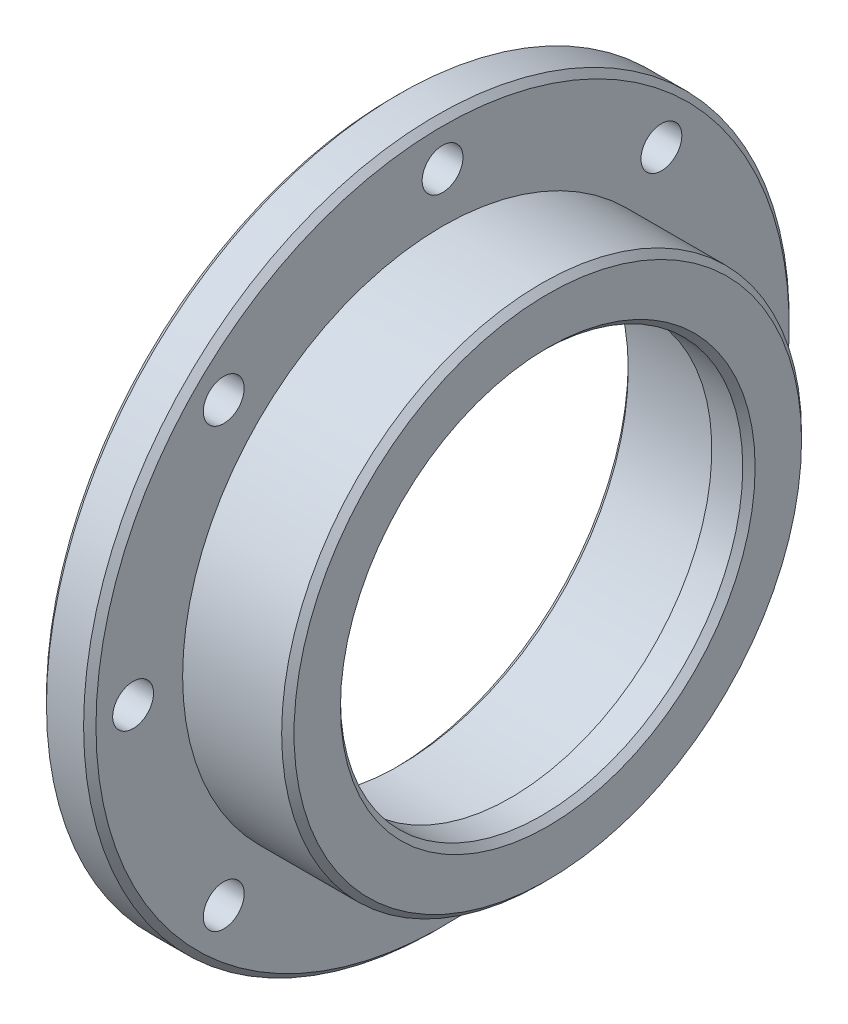
ISO-10303-21;
HEADER;
FILE_DESCRIPTION(('STEP AP214'),'2;1');
FILE_NAME('part.step','',(''),(''),'','','');
FILE_SCHEMA(('AUTOMOTIVE_DESIGN { 1 0 10303 214 1 1 1 1 }'));
ENDSEC;
DATA;
#1=APPLICATION_CONTEXT('core data for automotive mechanical design processes');
#2=APPLICATION_PROTOCOL_DEFINITION('international standard','automotive_design',2000,#1);
#3=PRODUCT_CONTEXT('',#1,'mechanical');
#4=PRODUCT('Part','Part','',(#3));
#5=PRODUCT_RELATED_PRODUCT_CATEGORY('part','',(#4));
#6=PRODUCT_DEFINITION_FORMATION('','',#4);
#7=PRODUCT_DEFINITION_CONTEXT('part definition',#1,'design');
#8=PRODUCT_DEFINITION('design','',#6,#7);
#9=PRODUCT_DEFINITION_SHAPE('','',#8);
#10=(LENGTH_UNIT() NAMED_UNIT(*) SI_UNIT(.MILLI.,.METRE.));
#11=(NAMED_UNIT(*) PLANE_ANGLE_UNIT() SI_UNIT($,.RADIAN.));
#12=(NAMED_UNIT(*) SI_UNIT($,.STERADIAN.) SOLID_ANGLE_UNIT());
#13=UNCERTAINTY_MEASURE_WITH_UNIT(LENGTH_MEASURE(1.E-05),#10,'distance_accuracy_value','');
#14=(GEOMETRIC_REPRESENTATION_CONTEXT(3) GLOBAL_UNCERTAINTY_ASSIGNED_CONTEXT((#13)) GLOBAL_UNIT_ASSIGNED_CONTEXT((#10,
#11,#12)) REPRESENTATION_CONTEXT('',''));
#15=CARTESIAN_POINT('',(0.,0.,0.));
#16=DIRECTION('',(0.,0.,1.));
#17=DIRECTION('',(1.,0.,0.));
#18=AXIS2_PLACEMENT_3D('',#15,#16,#17);
#19=CARTESIAN_POINT('',(4.,21.,0.));
#20=DIRECTION('',(-1.,0.,0.));
#21=DIRECTION('',(0.,0.,1.));
#22=AXIS2_PLACEMENT_3D('',#19,#20,#21);
#23=PLANE('',#22);
#24=CARTESIAN_POINT('',(4.,17.6776695296639,17.6776695296635));
#25=DIRECTION('',(1.,0.,0.));
#26=DIRECTION('',(0.,0.,-1.));
#27=AXIS2_PLACEMENT_3D('',#24,#25,#26);
#28=CIRCLE('',#27,1.64999999999999);
#29=CARTESIAN_POINT('',(4.,17.6776695296639,16.0276695296635));
#30=VERTEX_POINT('',#29);
#31=EDGE_CURVE('E172',#30,#30,#28,.T.);
#32=ORIENTED_EDGE('',*,*,#31,.F.);
#33=EDGE_LOOP('',(#32));
#34=FACE_BOUND('',#33,.T.);
#35=CARTESIAN_POINT('',(4.,-17.6776695296635,17.6776695296638));
#36=DIRECTION('',(1.,0.,0.));
#37=DIRECTION('',(0.,0.,-1.));
#38=AXIS2_PLACEMENT_3D('',#35,#36,#37);
#39=CIRCLE('',#38,1.64999999999999);
#40=CARTESIAN_POINT('',(4.,-17.6776695296635,16.0276695296639));
#41=VERTEX_POINT('',#40);
#42=EDGE_CURVE('E156',#41,#41,#39,.T.);
#43=ORIENTED_EDGE('',*,*,#42,.F.);
#44=EDGE_LOOP('',(#43));
#45=FACE_BOUND('',#44,.T.);
#46=CARTESIAN_POINT('',(4.,-25.,0.));
#47=DIRECTION('',(1.,0.,0.));
#48=DIRECTION('',(0.,0.,-1.));
#49=AXIS2_PLACEMENT_3D('',#46,#47,#48);
#50=CIRCLE('',#49,1.64999999999999);
#51=CARTESIAN_POINT('',(4.,-25.,-1.64999999999999));
#52=VERTEX_POINT('',#51);
#53=EDGE_CURVE('E148',#52,#52,#50,.T.);
#54=ORIENTED_EDGE('',*,*,#53,.F.);
#55=EDGE_LOOP('',(#54));
#56=FACE_BOUND('',#55,.T.);
#57=CARTESIAN_POINT('',(4.,-17.6776695296638,-17.6776695296636));
#58=DIRECTION('',(1.,0.,0.));
#59=DIRECTION('',(0.,0.,-1.));
#60=AXIS2_PLACEMENT_3D('',#57,#58,#59);
#61=CIRCLE('',#60,1.64999999999999);
#62=CARTESIAN_POINT('',(4.,-17.6776695296638,-19.3276695296636));
#63=VERTEX_POINT('',#62);
#64=EDGE_CURVE('E140',#63,#63,#61,.T.);
#65=ORIENTED_EDGE('',*,*,#64,.F.);
#66=EDGE_LOOP('',(#65));
#67=FACE_BOUND('',#66,.T.);
#68=CARTESIAN_POINT('',(4.,0.,-25.));
#69=DIRECTION('',(1.,0.,0.));
#70=DIRECTION('',(0.,0.,-1.));
#71=AXIS2_PLACEMENT_3D('',#68,#69,#70);
#72=CIRCLE('',#71,1.64999999999999);
#73=CARTESIAN_POINT('',(4.,0.,-26.65));
#74=VERTEX_POINT('',#73);
#75=EDGE_CURVE('E132',#74,#74,#72,.T.);
#76=ORIENTED_EDGE('',*,*,#75,.F.);
#77=EDGE_LOOP('',(#76));
#78=FACE_BOUND('',#77,.T.);
#79=CARTESIAN_POINT('',(4.,17.6776695296637,-17.6776695296637));
#80=DIRECTION('',(1.,0.,0.));
#81=DIRECTION('',(0.,0.,-1.));
#82=AXIS2_PLACEMENT_3D('',#79,#80,#81);
#83=CIRCLE('',#82,1.64999999999999);
#84=CARTESIAN_POINT('',(4.,17.6776695296637,-19.3276695296637));
#85=VERTEX_POINT('',#84);
#86=EDGE_CURVE('E124',#85,#85,#83,.T.);
#87=ORIENTED_EDGE('',*,*,#86,.F.);
#88=EDGE_LOOP('',(#87));
#89=FACE_BOUND('',#88,.T.);
#90=CARTESIAN_POINT('',(4.,25.,0.));
#91=DIRECTION('',(1.,0.,0.));
#92=DIRECTION('',(0.,0.,-1.));
#93=AXIS2_PLACEMENT_3D('',#90,#91,#92);
#94=CIRCLE('',#93,1.64999999999999);
#95=CARTESIAN_POINT('',(4.,25.,-1.64999999999999));
#96=VERTEX_POINT('',#95);
#97=EDGE_CURVE('E116',#96,#96,#94,.T.);
#98=ORIENTED_EDGE('',*,*,#97,.F.);
#99=EDGE_LOOP('',(#98));
#100=FACE_BOUND('',#99,.T.);
#101=CARTESIAN_POINT('',(4.,0.,0.));
#102=DIRECTION('',(-1.,0.,0.));
#103=DIRECTION('',(0.,0.,1.));
#104=AXIS2_PLACEMENT_3D('',#101,#102,#103);
#105=CIRCLE('',#104,28.);
#106=CARTESIAN_POINT('',(4.,0.,28.));
#107=VERTEX_POINT('',#106);
#108=EDGE_CURVE('E58',#107,#107,#105,.F.);
#109=ORIENTED_EDGE('',*,*,#108,.T.);
#110=EDGE_LOOP('',(#109));
#111=FACE_BOUND('',#110,.T.);
#112=CARTESIAN_POINT('',(4.,0.,0.));
#113=DIRECTION('',(-1.,0.,0.));
#114=DIRECTION('',(0.,0.,1.));
#115=AXIS2_PLACEMENT_3D('',#112,#113,#114);
#116=CIRCLE('',#115,21.);
#117=CARTESIAN_POINT('',(4.,0.,21.));
#118=VERTEX_POINT('',#117);
#119=EDGE_CURVE('E102',#118,#118,#116,.F.);
#120=ORIENTED_EDGE('',*,*,#119,.F.);
#121=EDGE_LOOP('',(#120));
#122=FACE_BOUND('',#121,.T.);
#123=CARTESIAN_POINT('',(4.,2.61861100413235E-13,25.));
#124=DIRECTION('',(1.,0.,0.));
#125=DIRECTION('',(0.,0.,-1.));
#126=AXIS2_PLACEMENT_3D('',#123,#124,#125);
#127=CIRCLE('',#126,1.64999999999999);
#128=CARTESIAN_POINT('',(4.,2.61861100413235E-13,23.35));
#129=VERTEX_POINT('',#128);
#130=EDGE_CURVE('E164',#129,#129,#127,.T.);
#131=ORIENTED_EDGE('',*,*,#130,.F.);
#132=EDGE_LOOP('',(#131));
#133=FACE_BOUND('',#132,.T.);
#134=ADVANCED_FACE('F49',(#34,#45,#56,#67,#78,#89,#100,#111,#122,#133),#23,.F.);
#135=CARTESIAN_POINT('',(9.5,21.,0.));
#136=DIRECTION('',(1.,0.,0.));
#137=DIRECTION('',(0.,0.,-1.));
#138=AXIS2_PLACEMENT_3D('',#135,#136,#137);
#139=PLANE('',#138);
#140=CARTESIAN_POINT('',(9.5,0.,0.));
#141=DIRECTION('',(-1.,0.,0.));
#142=DIRECTION('',(0.,0.,1.));
#143=AXIS2_PLACEMENT_3D('',#140,#141,#142);
#144=CIRCLE('',#143,16.25);
#145=CARTESIAN_POINT('',(9.5,0.,16.25));
#146=VERTEX_POINT('',#145);
#147=EDGE_CURVE('E106',#146,#146,#144,.T.);
#148=ORIENTED_EDGE('',*,*,#147,.F.);
#149=EDGE_LOOP('',(#148));
#150=FACE_BOUND('',#149,.T.);
#151=CARTESIAN_POINT('',(9.5,0.,0.));
#152=DIRECTION('',(1.,0.,0.));
#153=DIRECTION('',(0.,0.,-1.));
#154=AXIS2_PLACEMENT_3D('',#151,#152,#153);
#155=CIRCLE('',#154,18.5);
#156=CARTESIAN_POINT('',(9.5,0.,-18.5));
#157=VERTEX_POINT('',#156);
#158=EDGE_CURVE('E101',#157,#157,#155,.T.);
#159=ORIENTED_EDGE('',*,*,#158,.F.);
#160=EDGE_LOOP('',(#159));
#161=FACE_BOUND('',#160,.T.);
#162=ADVANCED_FACE('F182',(#150,#161),#139,.F.);
#163=CARTESIAN_POINT('',(12.5,21.,0.));
#164=DIRECTION('',(1.,0.,0.));
#165=DIRECTION('',(0.,0.,-1.));
#166=AXIS2_PLACEMENT_3D('',#163,#164,#165);
#167=PLANE('',#166);
#168=CARTESIAN_POINT('',(12.5,0.,0.));
#169=DIRECTION('',(1.,0.,0.));
#170=DIRECTION('',(0.,0.,-1.));
#171=AXIS2_PLACEMENT_3D('',#168,#169,#170);
#172=CIRCLE('',#171,20.5);
#173=CARTESIAN_POINT('',(12.5,0.,-20.5));
#174=VERTEX_POINT('',#173);
#175=EDGE_CURVE('E89',#174,#174,#172,.T.);
#176=ORIENTED_EDGE('',*,*,#175,.T.);
#177=EDGE_LOOP('',(#176));
#178=FACE_BOUND('',#177,.T.);
#179=CARTESIAN_POINT('',(12.5,0.,0.));
#180=DIRECTION('',(1.,0.,0.));
#181=DIRECTION('',(0.,0.,-1.));
#182=AXIS2_PLACEMENT_3D('',#179,#180,#181);
#183=CIRCLE('',#182,16.75);
#184=CARTESIAN_POINT('',(12.5,0.,-16.75));
#185=VERTEX_POINT('',#184);
#186=EDGE_CURVE('E93',#185,#185,#183,.F.);
#187=ORIENTED_EDGE('',*,*,#186,.T.);
#188=EDGE_LOOP('',(#187));
#189=FACE_BOUND('',#188,.T.);
#190=ADVANCED_FACE('F245',(#178,#189),#167,.T.);
#191=CARTESIAN_POINT('',(0.,0.,0.));
#192=DIRECTION('',(-1.,0.,0.));
#193=DIRECTION('',(0.,0.,1.));
#194=AXIS2_PLACEMENT_3D('',#191,#192,#193);
#195=CYLINDRICAL_SURFACE('',#194,21.);
#196=CARTESIAN_POINT('',(12.,0.,0.));
#197=DIRECTION('',(1.,0.,0.));
#198=DIRECTION('',(0.,0.,-1.));
#199=AXIS2_PLACEMENT_3D('',#196,#197,#198);
#200=CIRCLE('',#199,21.);
#201=CARTESIAN_POINT('',(12.,0.,-21.));
#202=VERTEX_POINT('',#201);
#203=EDGE_CURVE('E97',#202,#202,#200,.F.);
#204=ORIENTED_EDGE('',*,*,#203,.T.);
#205=EDGE_LOOP('',(#204));
#206=FACE_BOUND('',#205,.T.);
#207=ORIENTED_EDGE('',*,*,#119,.T.);
#208=EDGE_LOOP('',(#207));
#209=FACE_BOUND('',#208,.T.);
#210=ADVANCED_FACE('F240',(#206,#209),#195,.T.);
#211=CARTESIAN_POINT('',(0.,0.,0.));
#212=DIRECTION('',(-1.,0.,0.));
#213=DIRECTION('',(0.,0.,1.));
#214=AXIS2_PLACEMENT_3D('',#211,#212,#213);
#215=CYLINDRICAL_SURFACE('',#214,16.25);
#216=CARTESIAN_POINT('',(12.,0.,0.));
#217=DIRECTION('',(1.,0.,0.));
#218=DIRECTION('',(0.,0.,-1.));
#219=AXIS2_PLACEMENT_3D('',#216,#217,#218);
#220=CIRCLE('',#219,16.25);
#221=CARTESIAN_POINT('',(12.,0.,-16.25));
#222=VERTEX_POINT('',#221);
#223=EDGE_CURVE('E85',#222,#222,#220,.T.);
#224=ORIENTED_EDGE('',*,*,#223,.T.);
#225=EDGE_LOOP('',(#224));
#226=FACE_BOUND('',#225,.T.);
#227=ORIENTED_EDGE('',*,*,#147,.T.);
#228=EDGE_LOOP('',(#227));
#229=FACE_BOUND('',#228,.T.);
#230=ADVANCED_FACE('F236',(#226,#229),#215,.F.);
#231=CARTESIAN_POINT('',(0.,0.,0.));
#232=DIRECTION('',(-1.,0.,0.));
#233=DIRECTION('',(0.,0.,1.));
#234=AXIS2_PLACEMENT_3D('',#231,#232,#233);
#235=CYLINDRICAL_SURFACE('',#234,28.5);
#236=CARTESIAN_POINT('',(0.500000000000004,0.,0.));
#237=DIRECTION('',(1.,0.,0.));
#238=DIRECTION('',(0.,0.,-1.));
#239=AXIS2_PLACEMENT_3D('',#236,#237,#238);
#240=CIRCLE('',#239,28.5);
#241=CARTESIAN_POINT('',(0.500000000000004,0.,-28.5));
#242=VERTEX_POINT('',#241);
#243=EDGE_CURVE('E66',#242,#242,#240,.T.);
#244=ORIENTED_EDGE('',*,*,#243,.T.);
#245=EDGE_LOOP('',(#244));
#246=FACE_BOUND('',#245,.T.);
#247=CARTESIAN_POINT('',(3.49999999999999,0.,0.));
#248=DIRECTION('',(-1.,0.,0.));
#249=DIRECTION('',(0.,0.,1.));
#250=AXIS2_PLACEMENT_3D('',#247,#248,#249);
#251=CIRCLE('',#250,28.5);
#252=CARTESIAN_POINT('',(3.49999999999999,0.,28.5));
#253=VERTEX_POINT('',#252);
#254=EDGE_CURVE('E74',#253,#253,#251,.T.);
#255=ORIENTED_EDGE('',*,*,#254,.T.);
#256=EDGE_LOOP('',(#255));
#257=FACE_BOUND('',#256,.T.);
#258=ADVANCED_FACE('F239',(#246,#257),#235,.T.);
#259=CARTESIAN_POINT('',(0.,21.,0.));
#260=DIRECTION('',(1.,0.,0.));
#261=DIRECTION('',(0.,0.,-1.));
#262=AXIS2_PLACEMENT_3D('',#259,#260,#261);
#263=PLANE('',#262);
#264=CARTESIAN_POINT('',(0.,17.6776695296639,17.6776695296635));
#265=DIRECTION('',(1.,0.,0.));
#266=DIRECTION('',(0.,0.,-1.));
#267=AXIS2_PLACEMENT_3D('',#264,#265,#266);
#268=CIRCLE('',#267,1.65);
#269=CARTESIAN_POINT('',(0.,17.6776695296639,16.0276695296635));
#270=VERTEX_POINT('',#269);
#271=EDGE_CURVE('E168',#270,#270,#268,.T.);
#272=ORIENTED_EDGE('',*,*,#271,.T.);
#273=EDGE_LOOP('',(#272));
#274=FACE_BOUND('',#273,.T.);
#275=CARTESIAN_POINT('',(0.,2.61861100413235E-13,25.));
#276=DIRECTION('',(1.,0.,0.));
#277=DIRECTION('',(0.,0.,-1.));
#278=AXIS2_PLACEMENT_3D('',#275,#276,#277);
#279=CIRCLE('',#278,1.65);
#280=CARTESIAN_POINT('',(0.,2.61861100413235E-13,23.35));
#281=VERTEX_POINT('',#280);
#282=EDGE_CURVE('E160',#281,#281,#279,.T.);
#283=ORIENTED_EDGE('',*,*,#282,.T.);
#284=EDGE_LOOP('',(#283));
#285=FACE_BOUND('',#284,.T.);
#286=CARTESIAN_POINT('',(0.,-17.6776695296635,17.6776695296638));
#287=DIRECTION('',(1.,0.,0.));
#288=DIRECTION('',(0.,0.,-1.));
#289=AXIS2_PLACEMENT_3D('',#286,#287,#288);
#290=CIRCLE('',#289,1.65);
#291=CARTESIAN_POINT('',(0.,-17.6776695296635,16.0276695296638));
#292=VERTEX_POINT('',#291);
#293=EDGE_CURVE('E152',#292,#292,#290,.T.);
#294=ORIENTED_EDGE('',*,*,#293,.T.);
#295=EDGE_LOOP('',(#294));
#296=FACE_BOUND('',#295,.T.);
#297=CARTESIAN_POINT('',(0.,-25.,0.));
#298=DIRECTION('',(1.,0.,0.));
#299=DIRECTION('',(0.,0.,-1.));
#300=AXIS2_PLACEMENT_3D('',#297,#298,#299);
#301=CIRCLE('',#300,1.65);
#302=CARTESIAN_POINT('',(0.,-25.,-1.65));
#303=VERTEX_POINT('',#302);
#304=EDGE_CURVE('E144',#303,#303,#301,.T.);
#305=ORIENTED_EDGE('',*,*,#304,.T.);
#306=EDGE_LOOP('',(#305));
#307=FACE_BOUND('',#306,.T.);
#308=CARTESIAN_POINT('',(0.,-17.6776695296638,-17.6776695296636));
#309=DIRECTION('',(1.,0.,0.));
#310=DIRECTION('',(0.,0.,-1.));
#311=AXIS2_PLACEMENT_3D('',#308,#309,#310);
#312=CIRCLE('',#311,1.65);
#313=CARTESIAN_POINT('',(0.,-17.6776695296638,-19.3276695296636));
#314=VERTEX_POINT('',#313);
#315=EDGE_CURVE('E136',#314,#314,#312,.T.);
#316=ORIENTED_EDGE('',*,*,#315,.T.);
#317=EDGE_LOOP('',(#316));
#318=FACE_BOUND('',#317,.T.);
#319=CARTESIAN_POINT('',(0.,0.,-25.));
#320=DIRECTION('',(1.,0.,0.));
#321=DIRECTION('',(0.,0.,-1.));
#322=AXIS2_PLACEMENT_3D('',#319,#320,#321);
#323=CIRCLE('',#322,1.65);
#324=CARTESIAN_POINT('',(0.,0.,-26.65));
#325=VERTEX_POINT('',#324);
#326=EDGE_CURVE('E128',#325,#325,#323,.T.);
#327=ORIENTED_EDGE('',*,*,#326,.T.);
#328=EDGE_LOOP('',(#327));
#329=FACE_BOUND('',#328,.T.);
#330=CARTESIAN_POINT('',(0.,17.6776695296637,-17.6776695296637));
#331=DIRECTION('',(1.,0.,0.));
#332=DIRECTION('',(0.,0.,-1.));
#333=AXIS2_PLACEMENT_3D('',#330,#331,#332);
#334=CIRCLE('',#333,1.65);
#335=CARTESIAN_POINT('',(0.,17.6776695296637,-19.3276695296637));
#336=VERTEX_POINT('',#335);
#337=EDGE_CURVE('E120',#336,#336,#334,.T.);
#338=ORIENTED_EDGE('',*,*,#337,.T.);
#339=EDGE_LOOP('',(#338));
#340=FACE_BOUND('',#339,.T.);
#341=CARTESIAN_POINT('',(0.,25.,0.));
#342=DIRECTION('',(1.,0.,0.));
#343=DIRECTION('',(0.,0.,-1.));
#344=AXIS2_PLACEMENT_3D('',#341,#342,#343);
#345=CIRCLE('',#344,1.65);
#346=CARTESIAN_POINT('',(0.,25.,-1.65));
#347=VERTEX_POINT('',#346);
#348=EDGE_CURVE('E107',#347,#347,#345,.T.);
#349=ORIENTED_EDGE('',*,*,#348,.T.);
#350=EDGE_LOOP('',(#349));
#351=FACE_BOUND('',#350,.T.);
#352=CARTESIAN_POINT('',(0.,0.,0.));
#353=DIRECTION('',(1.,0.,0.));
#354=DIRECTION('',(0.,0.,-1.));
#355=AXIS2_PLACEMENT_3D('',#352,#353,#354);
#356=CIRCLE('',#355,28.);
#357=CARTESIAN_POINT('',(0.,0.,-28.));
#358=VERTEX_POINT('',#357);
#359=EDGE_CURVE('E79',#358,#358,#356,.F.);
#360=ORIENTED_EDGE('',*,*,#359,.T.);
#361=EDGE_LOOP('',(#360));
#362=FACE_BOUND('',#361,.T.);
#363=CARTESIAN_POINT('',(0.,0.,0.));
#364=DIRECTION('',(1.,0.,0.));
#365=DIRECTION('',(0.,0.,-1.));
#366=AXIS2_PLACEMENT_3D('',#363,#364,#365);
#367=CIRCLE('',#366,19.);
#368=CARTESIAN_POINT('',(0.,0.,-19.));
#369=VERTEX_POINT('',#368);
#370=EDGE_CURVE('E82',#369,#369,#367,.T.);
#371=ORIENTED_EDGE('',*,*,#370,.T.);
#372=EDGE_LOOP('',(#371));
#373=FACE_BOUND('',#372,.T.);
#374=ADVANCED_FACE('F255',(#274,#285,#296,#307,#318,#329,#340,#351,#362,#373),#263,.F.);
#375=CARTESIAN_POINT('',(0.,0.,0.));
#376=DIRECTION('',(-1.,0.,0.));
#377=DIRECTION('',(0.,0.,1.));
#378=AXIS2_PLACEMENT_3D('',#375,#376,#377);
#379=CYLINDRICAL_SURFACE('',#378,18.5);
#380=CARTESIAN_POINT('',(0.500000000000004,0.,0.));
#381=DIRECTION('',(1.,0.,0.));
#382=DIRECTION('',(0.,0.,-1.));
#383=AXIS2_PLACEMENT_3D('',#380,#381,#382);
#384=CIRCLE('',#383,18.5);
#385=CARTESIAN_POINT('',(0.500000000000004,0.,-18.5));
#386=VERTEX_POINT('',#385);
#387=EDGE_CURVE('E10',#386,#386,#384,.F.);
#388=ORIENTED_EDGE('',*,*,#387,.T.);
#389=EDGE_LOOP('',(#388));
#390=FACE_BOUND('',#389,.T.);
#391=ORIENTED_EDGE('',*,*,#158,.T.);
#392=EDGE_LOOP('',(#391));
#393=FACE_BOUND('',#392,.T.);
#394=ADVANCED_FACE('F184',(#390,#393),#379,.F.);
#395=CARTESIAN_POINT('',(12.,0.,0.));
#396=DIRECTION('',(-1.,0.,0.));
#397=DIRECTION('',(0.,0.,1.));
#398=AXIS2_PLACEMENT_3D('',#395,#396,#397);
#399=CONICAL_SURFACE('',#398,21.,0.785398163397448);
#400=ORIENTED_EDGE('',*,*,#175,.F.);
#401=EDGE_LOOP('',(#400));
#402=FACE_BOUND('',#401,.T.);
#403=ORIENTED_EDGE('',*,*,#203,.F.);
#404=EDGE_LOOP('',(#403));
#405=FACE_BOUND('',#404,.T.);
#406=ADVANCED_FACE('F242',(#402,#405),#399,.T.);
#407=CARTESIAN_POINT('',(12.5,0.,0.));
#408=DIRECTION('',(1.,0.,0.));
#409=DIRECTION('',(0.,0.,-1.));
#410=AXIS2_PLACEMENT_3D('',#407,#408,#409);
#411=CONICAL_SURFACE('',#410,16.75,0.785398163397445);
#412=ORIENTED_EDGE('',*,*,#223,.F.);
#413=EDGE_LOOP('',(#412));
#414=FACE_BOUND('',#413,.T.);
#415=ORIENTED_EDGE('',*,*,#186,.F.);
#416=EDGE_LOOP('',(#415));
#417=FACE_BOUND('',#416,.T.);
#418=ADVANCED_FACE('F268',(#414,#417),#411,.F.);
#419=CARTESIAN_POINT('',(0.,0.,0.));
#420=DIRECTION('',(1.,0.,0.));
#421=DIRECTION('',(0.,0.,-1.));
#422=AXIS2_PLACEMENT_3D('',#419,#420,#421);
#423=CONICAL_SURFACE('',#422,28.,0.785398163397445);
#424=ORIENTED_EDGE('',*,*,#243,.F.);
#425=EDGE_LOOP('',(#424));
#426=FACE_BOUND('',#425,.T.);
#427=ORIENTED_EDGE('',*,*,#359,.F.);
#428=EDGE_LOOP('',(#427));
#429=FACE_BOUND('',#428,.T.);
#430=ADVANCED_FACE('F275',(#426,#429),#423,.T.);
#431=CARTESIAN_POINT('',(3.49999999999999,0.,0.));
#432=DIRECTION('',(-1.,0.,0.));
#433=DIRECTION('',(0.,0.,1.));
#434=AXIS2_PLACEMENT_3D('',#431,#432,#433);
#435=CONICAL_SURFACE('',#434,28.5,0.785398163397448);
#436=ORIENTED_EDGE('',*,*,#108,.F.);
#437=EDGE_LOOP('',(#436));
#438=FACE_BOUND('',#437,.T.);
#439=ORIENTED_EDGE('',*,*,#254,.F.);
#440=EDGE_LOOP('',(#439));
#441=FACE_BOUND('',#440,.T.);
#442=ADVANCED_FACE('F281',(#438,#441),#435,.T.);
#443=CARTESIAN_POINT('',(0.500000000000004,0.,0.));
#444=DIRECTION('',(-1.,0.,0.));
#445=DIRECTION('',(0.,0.,1.));
#446=AXIS2_PLACEMENT_3D('',#443,#444,#445);
#447=CONICAL_SURFACE('',#446,18.5,0.785398163397448);
#448=ORIENTED_EDGE('',*,*,#370,.F.);
#449=EDGE_LOOP('',(#448));
#450=FACE_BOUND('',#449,.T.);
#451=ORIENTED_EDGE('',*,*,#387,.F.);
#452=EDGE_LOOP('',(#451));
#453=FACE_BOUND('',#452,.T.);
#454=ADVANCED_FACE('F52',(#450,#453),#447,.F.);
#455=CARTESIAN_POINT('',(4.,25.,0.));
#456=DIRECTION('',(1.,0.,0.));
#457=DIRECTION('',(0.,0.,-1.));
#458=AXIS2_PLACEMENT_3D('',#455,#456,#457);
#459=CYLINDRICAL_SURFACE('',#458,1.64999999999999);
#460=ORIENTED_EDGE('',*,*,#348,.F.);
#461=EDGE_LOOP('',(#460));
#462=FACE_BOUND('',#461,.T.);
#463=ORIENTED_EDGE('',*,*,#97,.T.);
#464=EDGE_LOOP('',(#463));
#465=FACE_BOUND('',#464,.T.);
#466=ADVANCED_FACE('F231',(#462,#465),#459,.F.);
#467=CARTESIAN_POINT('',(4.,17.6776695296637,-17.6776695296637));
#468=DIRECTION('',(1.,0.,0.));
#469=DIRECTION('',(0.,0.,-1.));
#470=AXIS2_PLACEMENT_3D('',#467,#468,#469);
#471=CYLINDRICAL_SURFACE('',#470,1.64999999999999);
#472=ORIENTED_EDGE('',*,*,#337,.F.);
#473=EDGE_LOOP('',(#472));
#474=FACE_BOUND('',#473,.T.);
#475=ORIENTED_EDGE('',*,*,#86,.T.);
#476=EDGE_LOOP('',(#475));
#477=FACE_BOUND('',#476,.T.);
#478=ADVANCED_FACE('F227',(#474,#477),#471,.F.);
#479=CARTESIAN_POINT('',(4.,0.,-25.));
#480=DIRECTION('',(1.,0.,0.));
#481=DIRECTION('',(0.,0.,-1.));
#482=AXIS2_PLACEMENT_3D('',#479,#480,#481);
#483=CYLINDRICAL_SURFACE('',#482,1.64999999999999);
#484=ORIENTED_EDGE('',*,*,#326,.F.);
#485=EDGE_LOOP('',(#484));
#486=FACE_BOUND('',#485,.T.);
#487=ORIENTED_EDGE('',*,*,#75,.T.);
#488=EDGE_LOOP('',(#487));
#489=FACE_BOUND('',#488,.T.);
#490=ADVANCED_FACE('F223',(#486,#489),#483,.F.);
#491=CARTESIAN_POINT('',(4.,-17.6776695296638,-17.6776695296636));
#492=DIRECTION('',(1.,0.,0.));
#493=DIRECTION('',(0.,0.,-1.));
#494=AXIS2_PLACEMENT_3D('',#491,#492,#493);
#495=CYLINDRICAL_SURFACE('',#494,1.64999999999999);
#496=ORIENTED_EDGE('',*,*,#315,.F.);
#497=EDGE_LOOP('',(#496));
#498=FACE_BOUND('',#497,.T.);
#499=ORIENTED_EDGE('',*,*,#64,.T.);
#500=EDGE_LOOP('',(#499));
#501=FACE_BOUND('',#500,.T.);
#502=ADVANCED_FACE('F219',(#498,#501),#495,.F.);
#503=CARTESIAN_POINT('',(4.,-25.,0.));
#504=DIRECTION('',(1.,0.,0.));
#505=DIRECTION('',(0.,0.,-1.));
#506=AXIS2_PLACEMENT_3D('',#503,#504,#505);
#507=CYLINDRICAL_SURFACE('',#506,1.64999999999999);
#508=ORIENTED_EDGE('',*,*,#304,.F.);
#509=EDGE_LOOP('',(#508));
#510=FACE_BOUND('',#509,.T.);
#511=ORIENTED_EDGE('',*,*,#53,.T.);
#512=EDGE_LOOP('',(#511));
#513=FACE_BOUND('',#512,.T.);
#514=ADVANCED_FACE('F212',(#510,#513),#507,.F.);
#515=CARTESIAN_POINT('',(4.,-17.6776695296635,17.6776695296638));
#516=DIRECTION('',(1.,0.,0.));
#517=DIRECTION('',(0.,0.,-1.));
#518=AXIS2_PLACEMENT_3D('',#515,#516,#517);
#519=CYLINDRICAL_SURFACE('',#518,1.64999999999999);
#520=ORIENTED_EDGE('',*,*,#293,.F.);
#521=EDGE_LOOP('',(#520));
#522=FACE_BOUND('',#521,.T.);
#523=ORIENTED_EDGE('',*,*,#42,.T.);
#524=EDGE_LOOP('',(#523));
#525=FACE_BOUND('',#524,.T.);
#526=ADVANCED_FACE('F203',(#522,#525),#519,.F.);
#527=CARTESIAN_POINT('',(4.,2.61861100413235E-13,25.));
#528=DIRECTION('',(1.,0.,0.));
#529=DIRECTION('',(0.,0.,-1.));
#530=AXIS2_PLACEMENT_3D('',#527,#528,#529);
#531=CYLINDRICAL_SURFACE('',#530,1.64999999999999);
#532=ORIENTED_EDGE('',*,*,#282,.F.);
#533=EDGE_LOOP('',(#532));
#534=FACE_BOUND('',#533,.T.);
#535=ORIENTED_EDGE('',*,*,#130,.T.);
#536=EDGE_LOOP('',(#535));
#537=FACE_BOUND('',#536,.T.);
#538=ADVANCED_FACE('F201',(#534,#537),#531,.F.);
#539=CARTESIAN_POINT('',(4.,17.6776695296639,17.6776695296635));
#540=DIRECTION('',(1.,0.,0.));
#541=DIRECTION('',(0.,0.,-1.));
#542=AXIS2_PLACEMENT_3D('',#539,#540,#541);
#543=CYLINDRICAL_SURFACE('',#542,1.64999999999999);
#544=ORIENTED_EDGE('',*,*,#271,.F.);
#545=EDGE_LOOP('',(#544));
#546=FACE_BOUND('',#545,.T.);
#547=ORIENTED_EDGE('',*,*,#31,.T.);
#548=EDGE_LOOP('',(#547));
#549=FACE_BOUND('',#548,.T.);
#550=ADVANCED_FACE('F178',(#546,#549),#543,.F.);
#551=CLOSED_SHELL('',(#134,#162,#190,#210,#230,#258,#374,#394,#406,#418,#430,#442,#454,#466,
#478,#490,#502,#514,#526,#538,#550));
#552=MANIFOLD_SOLID_BREP('B2',#551);
#553=ADVANCED_BREP_SHAPE_REPRESENTATION('',(#18,#552),#14);
#554=SHAPE_DEFINITION_REPRESENTATION(#9,#553);
ENDSEC;
END-ISO-10303-21;
